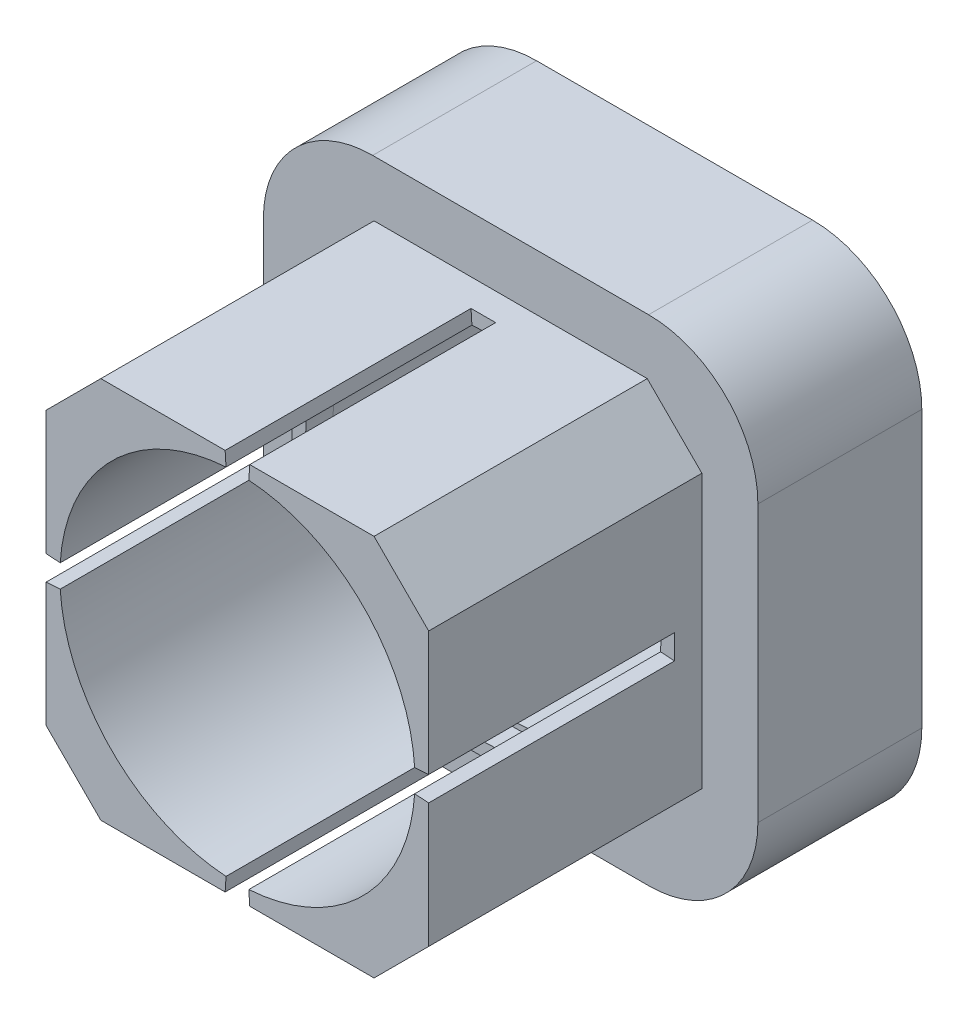
ISO-10303-21;
HEADER;
FILE_DESCRIPTION(('STEP AP214'),'2;1');
FILE_NAME('part.step','',(''),(''),'','','');
FILE_SCHEMA(('AUTOMOTIVE_DESIGN { 1 0 10303 214 1 1 1 1 }'));
ENDSEC;
DATA;
#1=APPLICATION_CONTEXT('core data for automotive mechanical design processes');
#2=APPLICATION_PROTOCOL_DEFINITION('international standard','automotive_design',2000,#1);
#3=PRODUCT_CONTEXT('',#1,'mechanical');
#4=PRODUCT('Part','Part','',(#3));
#5=PRODUCT_RELATED_PRODUCT_CATEGORY('part','',(#4));
#6=PRODUCT_DEFINITION_FORMATION('','',#4);
#7=PRODUCT_DEFINITION_CONTEXT('part definition',#1,'design');
#8=PRODUCT_DEFINITION('design','',#6,#7);
#9=PRODUCT_DEFINITION_SHAPE('','',#8);
#10=(LENGTH_UNIT() NAMED_UNIT(*) SI_UNIT(.MILLI.,.METRE.));
#11=(NAMED_UNIT(*) PLANE_ANGLE_UNIT() SI_UNIT($,.RADIAN.));
#12=(NAMED_UNIT(*) SI_UNIT($,.STERADIAN.) SOLID_ANGLE_UNIT());
#13=UNCERTAINTY_MEASURE_WITH_UNIT(LENGTH_MEASURE(1.E-05),#10,'distance_accuracy_value','');
#14=(GEOMETRIC_REPRESENTATION_CONTEXT(3) GLOBAL_UNCERTAINTY_ASSIGNED_CONTEXT((#13)) GLOBAL_UNIT_ASSIGNED_CONTEXT((#10,
#11,#12)) REPRESENTATION_CONTEXT('',''));
#15=CARTESIAN_POINT('',(0.,0.,0.));
#16=DIRECTION('',(0.,0.,1.));
#17=DIRECTION('',(1.,0.,0.));
#18=AXIS2_PLACEMENT_3D('',#15,#16,#17);
#19=CARTESIAN_POINT('',(0.,0.,16.));
#20=DIRECTION('',(0.,0.,1.));
#21=DIRECTION('',(1.,0.,0.));
#22=AXIS2_PLACEMENT_3D('',#19,#20,#21);
#23=PLANE('',#22);
#24=DIRECTION('',(-0.064153289317511,-0.997940056050334,0.));
#25=VECTOR('',#24,1.);
#26=CARTESIAN_POINT('',(-0.449999999999927,-7.,16.));
#27=LINE('',#26,#25);
#28=CARTESIAN_POINT('',(-0.416996380563821,-6.48661036432717,16.));
#29=VERTEX_POINT('',#28);
#30=CARTESIAN_POINT('',(-0.449999999999927,-7.,16.));
#31=VERTEX_POINT('',#30);
#32=EDGE_CURVE('E526',#29,#31,#27,.T.);
#33=ORIENTED_EDGE('',*,*,#32,.F.);
#34=CARTESIAN_POINT('',(0.,0.,16.));
#35=DIRECTION('',(0.,0.,1.));
#36=DIRECTION('',(1.,0.,0.));
#37=AXIS2_PLACEMENT_3D('',#34,#35,#36);
#38=CIRCLE('',#37,6.5);
#39=CARTESIAN_POINT('',(-6.48661036432717,-0.416996380563889,16.));
#40=VERTEX_POINT('',#39);
#41=EDGE_CURVE('E277',#40,#29,#38,.T.);
#42=ORIENTED_EDGE('',*,*,#41,.F.);
#43=DIRECTION('',(0.997940056050333,0.0641532893175214,0.));
#44=VECTOR('',#43,1.);
#45=CARTESIAN_POINT('',(0.,0.,16.));
#46=LINE('',#45,#44);
#47=CARTESIAN_POINT('',(-7.,-0.45,16.));
#48=VERTEX_POINT('',#47);
#49=EDGE_CURVE('E543',#48,#40,#46,.T.);
#50=ORIENTED_EDGE('',*,*,#49,.F.);
#51=DIRECTION('',(0.,-1.,0.));
#52=VECTOR('',#51,1.);
#53=CARTESIAN_POINT('',(-7.,-5.,16.));
#54=LINE('',#53,#52);
#55=CARTESIAN_POINT('',(-7.,-5.,16.));
#56=VERTEX_POINT('',#55);
#57=EDGE_CURVE('E311',#48,#56,#54,.T.);
#58=ORIENTED_EDGE('',*,*,#57,.T.);
#59=DIRECTION('',(0.707106781186548,-0.707106781186548,0.));
#60=VECTOR('',#59,1.);
#61=CARTESIAN_POINT('',(-7.,-5.,16.));
#62=LINE('',#61,#60);
#63=CARTESIAN_POINT('',(-5.,-7.,16.));
#64=VERTEX_POINT('',#63);
#65=EDGE_CURVE('E282',#56,#64,#62,.T.);
#66=ORIENTED_EDGE('',*,*,#65,.T.);
#67=DIRECTION('',(1.,0.,0.));
#68=VECTOR('',#67,1.);
#69=CARTESIAN_POINT('',(-5.,-7.,16.));
#70=LINE('',#69,#68);
#71=EDGE_CURVE('E288',#64,#31,#70,.T.);
#72=ORIENTED_EDGE('',*,*,#71,.T.);
#73=EDGE_LOOP('',(#33,#42,#50,#58,#66,#72));
#74=FACE_BOUND('',#73,.T.);
#75=ADVANCED_FACE('F41',(#74),#23,.T.);
#76=DIRECTION('',(-0.997940056050333,0.0641532893175214,0.));
#77=VECTOR('',#76,1.);
#78=CARTESIAN_POINT('',(-7.,0.45,16.));
#79=LINE('',#78,#77);
#80=CARTESIAN_POINT('',(-6.48661036432717,0.416996380563889,16.));
#81=VERTEX_POINT('',#80);
#82=CARTESIAN_POINT('',(-7.,0.45,16.));
#83=VERTEX_POINT('',#82);
#84=EDGE_CURVE('E536',#81,#83,#79,.T.);
#85=ORIENTED_EDGE('',*,*,#84,.F.);
#86=CARTESIAN_POINT('',(-0.416996380563912,6.48661036432717,16.));
#87=VERTEX_POINT('',#86);
#88=EDGE_CURVE('E636',#87,#81,#38,.T.);
#89=ORIENTED_EDGE('',*,*,#88,.F.);
#90=DIRECTION('',(0.0641532893175249,-0.997940056050333,0.));
#91=VECTOR('',#90,1.);
#92=CARTESIAN_POINT('',(0.,0.,16.));
#93=LINE('',#92,#91);
#94=CARTESIAN_POINT('',(-0.450000000000024,7.,16.));
#95=VERTEX_POINT('',#94);
#96=EDGE_CURVE('E565',#95,#87,#93,.T.);
#97=ORIENTED_EDGE('',*,*,#96,.F.);
#98=DIRECTION('',(-1.,0.,0.));
#99=VECTOR('',#98,1.);
#100=CARTESIAN_POINT('',(-4.99999999999999,7.,16.));
#101=LINE('',#100,#99);
#102=CARTESIAN_POINT('',(-4.99999999999999,7.,16.));
#103=VERTEX_POINT('',#102);
#104=EDGE_CURVE('E303',#95,#103,#101,.T.);
#105=ORIENTED_EDGE('',*,*,#104,.T.);
#106=DIRECTION('',(-0.70710678118655,-0.707106781186545,0.));
#107=VECTOR('',#106,1.);
#108=CARTESIAN_POINT('',(-4.99999999999999,7.,16.));
#109=LINE('',#108,#107);
#110=CARTESIAN_POINT('',(-7.,5.,16.));
#111=VERTEX_POINT('',#110);
#112=EDGE_CURVE('E308',#103,#111,#109,.T.);
#113=ORIENTED_EDGE('',*,*,#112,.T.);
#114=EDGE_CURVE('E312',#111,#83,#54,.T.);
#115=ORIENTED_EDGE('',*,*,#114,.T.);
#116=EDGE_LOOP('',(#85,#89,#97,#105,#113,#115));
#117=FACE_BOUND('',#116,.T.);
#118=ADVANCED_FACE('F674',(#117),#23,.T.);
#119=DIRECTION('',(0.0641532893175179,0.997940056050334,0.));
#120=VECTOR('',#119,1.);
#121=CARTESIAN_POINT('',(0.449999999999976,7.,16.));
#122=LINE('',#121,#120);
#123=CARTESIAN_POINT('',(0.416996380563867,6.48661036432717,16.));
#124=VERTEX_POINT('',#123);
#125=CARTESIAN_POINT('',(0.449999999999976,7.,16.));
#126=VERTEX_POINT('',#125);
#127=EDGE_CURVE('E557',#124,#126,#122,.T.);
#128=ORIENTED_EDGE('',*,*,#127,.F.);
#129=CARTESIAN_POINT('',(6.48661036432717,0.416996380563889,16.));
#130=VERTEX_POINT('',#129);
#131=EDGE_CURVE('E279',#130,#124,#38,.T.);
#132=ORIENTED_EDGE('',*,*,#131,.F.);
#133=DIRECTION('',(-0.997940056050333,-0.0641532893175214,0.));
#134=VECTOR('',#133,1.);
#135=CARTESIAN_POINT('',(0.,0.,16.));
#136=LINE('',#135,#134);
#137=CARTESIAN_POINT('',(7.,0.45,16.));
#138=VERTEX_POINT('',#137);
#139=EDGE_CURVE('E587',#138,#130,#136,.T.);
#140=ORIENTED_EDGE('',*,*,#139,.F.);
#141=DIRECTION('',(0.,1.,0.));
#142=VECTOR('',#141,1.);
#143=CARTESIAN_POINT('',(7.,-4.99999999999999,16.));
#144=LINE('',#143,#142);
#145=CARTESIAN_POINT('',(7.,5.,16.));
#146=VERTEX_POINT('',#145);
#147=EDGE_CURVE('E295',#138,#146,#144,.T.);
#148=ORIENTED_EDGE('',*,*,#147,.T.);
#149=DIRECTION('',(-0.707106781186547,0.707106781186548,0.));
#150=VECTOR('',#149,1.);
#151=CARTESIAN_POINT('',(5.,7.,16.));
#152=LINE('',#151,#150);
#153=CARTESIAN_POINT('',(5.,7.,16.));
#154=VERTEX_POINT('',#153);
#155=EDGE_CURVE('E300',#146,#154,#152,.T.);
#156=ORIENTED_EDGE('',*,*,#155,.T.);
#157=EDGE_CURVE('E304',#154,#126,#101,.T.);
#158=ORIENTED_EDGE('',*,*,#157,.T.);
#159=EDGE_LOOP('',(#128,#132,#140,#148,#156,#158));
#160=FACE_BOUND('',#159,.T.);
#161=ADVANCED_FACE('F628',(#160),#23,.T.);
#162=CARTESIAN_POINT('',(5.05,5.05,6.));
#163=DIRECTION('',(0.,0.,-1.));
#164=DIRECTION('',(-1.,0.,0.));
#165=AXIS2_PLACEMENT_3D('',#162,#163,#164);
#166=CYLINDRICAL_SURFACE('',#165,4.00000000000001);
#167=CARTESIAN_POINT('',(5.05,5.05,0.));
#168=DIRECTION('',(0.,0.,1.));
#169=DIRECTION('',(-1.,0.,0.));
#170=AXIS2_PLACEMENT_3D('',#167,#168,#169);
#171=CIRCLE('',#170,4.00000000000001);
#172=CARTESIAN_POINT('',(9.05,5.05,0.));
#173=VERTEX_POINT('',#172);
#174=CARTESIAN_POINT('',(5.05,9.05,0.));
#175=VERTEX_POINT('',#174);
#176=EDGE_CURVE('E379',#173,#175,#171,.T.);
#177=ORIENTED_EDGE('',*,*,#176,.T.);
#178=DIRECTION('',(0.,0.,-1.));
#179=VECTOR('',#178,1.);
#180=CARTESIAN_POINT('',(5.05,9.05,6.));
#181=LINE('',#180,#179);
#182=CARTESIAN_POINT('',(5.05,9.05,6.));
#183=VERTEX_POINT('',#182);
#184=EDGE_CURVE('E457',#183,#175,#181,.T.);
#185=ORIENTED_EDGE('',*,*,#184,.F.);
#186=CARTESIAN_POINT('',(5.05,5.05,6.));
#187=DIRECTION('',(0.,0.,1.));
#188=DIRECTION('',(-1.,0.,0.));
#189=AXIS2_PLACEMENT_3D('',#186,#187,#188);
#190=CIRCLE('',#189,4.00000000000001);
#191=CARTESIAN_POINT('',(9.05,5.05,6.));
#192=VERTEX_POINT('',#191);
#193=EDGE_CURVE('E380',#192,#183,#190,.T.);
#194=ORIENTED_EDGE('',*,*,#193,.F.);
#195=DIRECTION('',(0.,0.,-1.));
#196=VECTOR('',#195,1.);
#197=CARTESIAN_POINT('',(9.05,5.05,6.));
#198=LINE('',#197,#196);
#199=EDGE_CURVE('E406',#192,#173,#198,.T.);
#200=ORIENTED_EDGE('',*,*,#199,.T.);
#201=EDGE_LOOP('',(#177,#185,#194,#200));
#202=FACE_BOUND('',#201,.T.);
#203=ADVANCED_FACE('F43',(#202),#166,.T.);
#204=CARTESIAN_POINT('',(-5.05,9.05,6.));
#205=DIRECTION('',(0.,-1.,0.));
#206=DIRECTION('',(0.,0.,-1.));
#207=AXIS2_PLACEMENT_3D('',#204,#205,#206);
#208=PLANE('',#207);
#209=DIRECTION('',(-1.,0.,0.));
#210=VECTOR('',#209,1.);
#211=CARTESIAN_POINT('',(-5.05,9.05,0.));
#212=LINE('',#211,#210);
#213=CARTESIAN_POINT('',(-5.05,9.05,0.));
#214=VERTEX_POINT('',#213);
#215=EDGE_CURVE('E410',#175,#214,#212,.T.);
#216=ORIENTED_EDGE('',*,*,#215,.T.);
#217=DIRECTION('',(0.,0.,-1.));
#218=VECTOR('',#217,1.);
#219=CARTESIAN_POINT('',(-5.05,9.05,6.));
#220=LINE('',#219,#218);
#221=CARTESIAN_POINT('',(-5.05,9.05,6.));
#222=VERTEX_POINT('',#221);
#223=EDGE_CURVE('E453',#222,#214,#220,.T.);
#224=ORIENTED_EDGE('',*,*,#223,.F.);
#225=DIRECTION('',(-1.,0.,0.));
#226=VECTOR('',#225,1.);
#227=CARTESIAN_POINT('',(-5.05,9.05,6.));
#228=LINE('',#227,#226);
#229=EDGE_CURVE('E384',#183,#222,#228,.T.);
#230=ORIENTED_EDGE('',*,*,#229,.F.);
#231=ORIENTED_EDGE('',*,*,#184,.T.);
#232=EDGE_LOOP('',(#216,#224,#230,#231));
#233=FACE_BOUND('',#232,.T.);
#234=ADVANCED_FACE('F720',(#233),#208,.F.);
#235=CARTESIAN_POINT('',(-5.04999999999999,5.04999999999999,6.));
#236=DIRECTION('',(0.,0.,-1.));
#237=DIRECTION('',(-1.,0.,0.));
#238=AXIS2_PLACEMENT_3D('',#235,#236,#237);
#239=CYLINDRICAL_SURFACE('',#238,4.00000000000002);
#240=CARTESIAN_POINT('',(-5.04999999999999,5.04999999999999,0.));
#241=DIRECTION('',(0.,0.,1.));
#242=DIRECTION('',(-1.,0.,0.));
#243=AXIS2_PLACEMENT_3D('',#240,#241,#242);
#244=CIRCLE('',#243,4.00000000000002);
#245=CARTESIAN_POINT('',(-9.05,5.05,0.));
#246=VERTEX_POINT('',#245);
#247=EDGE_CURVE('E413',#214,#246,#244,.T.);
#248=ORIENTED_EDGE('',*,*,#247,.T.);
#249=DIRECTION('',(0.,0.,-1.));
#250=VECTOR('',#249,1.);
#251=CARTESIAN_POINT('',(-9.05,5.05,6.));
#252=LINE('',#251,#250);
#253=CARTESIAN_POINT('',(-9.05,5.05,6.));
#254=VERTEX_POINT('',#253);
#255=EDGE_CURVE('E449',#254,#246,#252,.T.);
#256=ORIENTED_EDGE('',*,*,#255,.F.);
#257=CARTESIAN_POINT('',(-5.04999999999999,5.04999999999999,6.));
#258=DIRECTION('',(0.,0.,1.));
#259=DIRECTION('',(-1.,0.,0.));
#260=AXIS2_PLACEMENT_3D('',#257,#258,#259);
#261=CIRCLE('',#260,4.00000000000002);
#262=EDGE_CURVE('E388',#222,#254,#261,.T.);
#263=ORIENTED_EDGE('',*,*,#262,.F.);
#264=ORIENTED_EDGE('',*,*,#223,.T.);
#265=EDGE_LOOP('',(#248,#256,#263,#264));
#266=FACE_BOUND('',#265,.T.);
#267=ADVANCED_FACE('F725',(#266),#239,.T.);
#268=CARTESIAN_POINT('',(-9.05,-5.05,6.));
#269=DIRECTION('',(1.,0.,0.));
#270=DIRECTION('',(0.,0.,-1.));
#271=AXIS2_PLACEMENT_3D('',#268,#269,#270);
#272=PLANE('',#271);
#273=DIRECTION('',(0.,-1.,0.));
#274=VECTOR('',#273,1.);
#275=CARTESIAN_POINT('',(-9.05,-5.05,0.));
#276=LINE('',#275,#274);
#277=CARTESIAN_POINT('',(-9.05,-5.05,0.));
#278=VERTEX_POINT('',#277);
#279=EDGE_CURVE('E416',#246,#278,#276,.T.);
#280=ORIENTED_EDGE('',*,*,#279,.T.);
#281=DIRECTION('',(0.,0.,-1.));
#282=VECTOR('',#281,1.);
#283=CARTESIAN_POINT('',(-9.05,-5.05,6.));
#284=LINE('',#283,#282);
#285=CARTESIAN_POINT('',(-9.05,-5.05,6.));
#286=VERTEX_POINT('',#285);
#287=EDGE_CURVE('E445',#286,#278,#284,.T.);
#288=ORIENTED_EDGE('',*,*,#287,.F.);
#289=DIRECTION('',(0.,-1.,0.));
#290=VECTOR('',#289,1.);
#291=CARTESIAN_POINT('',(-9.05,-5.05,6.));
#292=LINE('',#291,#290);
#293=EDGE_CURVE('E391',#254,#286,#292,.T.);
#294=ORIENTED_EDGE('',*,*,#293,.F.);
#295=ORIENTED_EDGE('',*,*,#255,.T.);
#296=EDGE_LOOP('',(#280,#288,#294,#295));
#297=FACE_BOUND('',#296,.T.);
#298=ADVANCED_FACE('F759',(#297),#272,.F.);
#299=CARTESIAN_POINT('',(-5.04999999999999,-5.04999999999999,6.));
#300=DIRECTION('',(0.,0.,-1.));
#301=DIRECTION('',(-1.,0.,0.));
#302=AXIS2_PLACEMENT_3D('',#299,#300,#301);
#303=CYLINDRICAL_SURFACE('',#302,4.00000000000001);
#304=CARTESIAN_POINT('',(-5.04999999999999,-5.04999999999999,0.));
#305=DIRECTION('',(0.,0.,1.));
#306=DIRECTION('',(-1.,0.,0.));
#307=AXIS2_PLACEMENT_3D('',#304,#305,#306);
#308=CIRCLE('',#307,4.00000000000001);
#309=CARTESIAN_POINT('',(-5.05,-9.05,0.));
#310=VERTEX_POINT('',#309);
#311=EDGE_CURVE('E419',#278,#310,#308,.T.);
#312=ORIENTED_EDGE('',*,*,#311,.T.);
#313=DIRECTION('',(0.,0.,-1.));
#314=VECTOR('',#313,1.);
#315=CARTESIAN_POINT('',(-5.05,-9.05,6.));
#316=LINE('',#315,#314);
#317=CARTESIAN_POINT('',(-5.05,-9.05,6.));
#318=VERTEX_POINT('',#317);
#319=EDGE_CURVE('E441',#318,#310,#316,.T.);
#320=ORIENTED_EDGE('',*,*,#319,.F.);
#321=CARTESIAN_POINT('',(-5.04999999999999,-5.04999999999999,6.));
#322=DIRECTION('',(0.,0.,1.));
#323=DIRECTION('',(-1.,0.,0.));
#324=AXIS2_PLACEMENT_3D('',#321,#322,#323);
#325=CIRCLE('',#324,4.00000000000001);
#326=EDGE_CURVE('E394',#286,#318,#325,.T.);
#327=ORIENTED_EDGE('',*,*,#326,.F.);
#328=ORIENTED_EDGE('',*,*,#287,.T.);
#329=EDGE_LOOP('',(#312,#320,#327,#328));
#330=FACE_BOUND('',#329,.T.);
#331=ADVANCED_FACE('F755',(#330),#303,.T.);
#332=CARTESIAN_POINT('',(-5.05,-9.05,6.));
#333=DIRECTION('',(0.,1.,0.));
#334=DIRECTION('',(0.,0.,1.));
#335=AXIS2_PLACEMENT_3D('',#332,#333,#334);
#336=PLANE('',#335);
#337=DIRECTION('',(1.,0.,0.));
#338=VECTOR('',#337,1.);
#339=CARTESIAN_POINT('',(-5.05,-9.05,0.));
#340=LINE('',#339,#338);
#341=CARTESIAN_POINT('',(5.05,-9.05,0.));
#342=VERTEX_POINT('',#341);
#343=EDGE_CURVE('E422',#310,#342,#340,.T.);
#344=ORIENTED_EDGE('',*,*,#343,.T.);
#345=DIRECTION('',(0.,0.,-1.));
#346=VECTOR('',#345,1.);
#347=CARTESIAN_POINT('',(5.05,-9.05,6.));
#348=LINE('',#347,#346);
#349=CARTESIAN_POINT('',(5.05,-9.05,6.));
#350=VERTEX_POINT('',#349);
#351=EDGE_CURVE('E437',#350,#342,#348,.T.);
#352=ORIENTED_EDGE('',*,*,#351,.F.);
#353=DIRECTION('',(1.,0.,0.));
#354=VECTOR('',#353,1.);
#355=CARTESIAN_POINT('',(-5.05,-9.05,6.));
#356=LINE('',#355,#354);
#357=EDGE_CURVE('E397',#318,#350,#356,.T.);
#358=ORIENTED_EDGE('',*,*,#357,.F.);
#359=ORIENTED_EDGE('',*,*,#319,.T.);
#360=EDGE_LOOP('',(#344,#352,#358,#359));
#361=FACE_BOUND('',#360,.T.);
#362=ADVANCED_FACE('F750',(#361),#336,.F.);
#363=CARTESIAN_POINT('',(5.04999999999999,-5.04999999999999,6.));
#364=DIRECTION('',(0.,0.,-1.));
#365=DIRECTION('',(-1.,0.,0.));
#366=AXIS2_PLACEMENT_3D('',#363,#364,#365);
#367=CYLINDRICAL_SURFACE('',#366,4.00000000000001);
#368=CARTESIAN_POINT('',(5.04999999999999,-5.04999999999999,0.));
#369=DIRECTION('',(0.,0.,1.));
#370=DIRECTION('',(-1.,0.,0.));
#371=AXIS2_PLACEMENT_3D('',#368,#369,#370);
#372=CIRCLE('',#371,4.00000000000001);
#373=CARTESIAN_POINT('',(9.05,-5.05,0.));
#374=VERTEX_POINT('',#373);
#375=EDGE_CURVE('E425',#342,#374,#372,.T.);
#376=ORIENTED_EDGE('',*,*,#375,.T.);
#377=DIRECTION('',(0.,0.,-1.));
#378=VECTOR('',#377,1.);
#379=CARTESIAN_POINT('',(9.05,-5.05,6.));
#380=LINE('',#379,#378);
#381=CARTESIAN_POINT('',(9.05,-5.05,6.));
#382=VERTEX_POINT('',#381);
#383=EDGE_CURVE('E433',#382,#374,#380,.T.);
#384=ORIENTED_EDGE('',*,*,#383,.F.);
#385=CARTESIAN_POINT('',(5.04999999999999,-5.04999999999999,6.));
#386=DIRECTION('',(0.,0.,1.));
#387=DIRECTION('',(-1.,0.,0.));
#388=AXIS2_PLACEMENT_3D('',#385,#386,#387);
#389=CIRCLE('',#388,4.00000000000001);
#390=EDGE_CURVE('E400',#350,#382,#389,.T.);
#391=ORIENTED_EDGE('',*,*,#390,.F.);
#392=ORIENTED_EDGE('',*,*,#351,.T.);
#393=EDGE_LOOP('',(#376,#384,#391,#392));
#394=FACE_BOUND('',#393,.T.);
#395=ADVANCED_FACE('F745',(#394),#367,.T.);
#396=CARTESIAN_POINT('',(9.05,-5.05,6.));
#397=DIRECTION('',(-1.,0.,0.));
#398=DIRECTION('',(0.,0.,1.));
#399=AXIS2_PLACEMENT_3D('',#396,#397,#398);
#400=PLANE('',#399);
#401=DIRECTION('',(0.,1.,0.));
#402=VECTOR('',#401,1.);
#403=CARTESIAN_POINT('',(9.05,-5.05,0.));
#404=LINE('',#403,#402);
#405=EDGE_CURVE('E385',#374,#173,#404,.T.);
#406=ORIENTED_EDGE('',*,*,#405,.T.);
#407=ORIENTED_EDGE('',*,*,#199,.F.);
#408=DIRECTION('',(0.,1.,0.));
#409=VECTOR('',#408,1.);
#410=CARTESIAN_POINT('',(9.05,-5.05,6.));
#411=LINE('',#410,#409);
#412=EDGE_CURVE('E403',#382,#192,#411,.T.);
#413=ORIENTED_EDGE('',*,*,#412,.F.);
#414=ORIENTED_EDGE('',*,*,#383,.T.);
#415=EDGE_LOOP('',(#406,#407,#413,#414));
#416=FACE_BOUND('',#415,.T.);
#417=ADVANCED_FACE('F743',(#416),#400,.F.);
#418=CARTESIAN_POINT('',(5.05,5.05,6.));
#419=DIRECTION('',(0.,0.,-1.));
#420=DIRECTION('',(-1.,0.,0.));
#421=AXIS2_PLACEMENT_3D('',#418,#419,#420);
#422=PLANE('',#421);
#423=DIRECTION('',(0.707106781186548,-0.707106781186548,0.));
#424=VECTOR('',#423,1.);
#425=CARTESIAN_POINT('',(-7.,-5.,6.));
#426=LINE('',#425,#424);
#427=CARTESIAN_POINT('',(-7.,-5.,6.));
#428=VERTEX_POINT('',#427);
#429=CARTESIAN_POINT('',(-5.,-7.,6.));
#430=VERTEX_POINT('',#429);
#431=EDGE_CURVE('E317',#428,#430,#426,.T.);
#432=ORIENTED_EDGE('',*,*,#431,.F.);
#433=DIRECTION('',(0.,-1.,0.));
#434=VECTOR('',#433,1.);
#435=CARTESIAN_POINT('',(-7.,-5.,6.));
#436=LINE('',#435,#434);
#437=CARTESIAN_POINT('',(-7.,5.,6.));
#438=VERTEX_POINT('',#437);
#439=EDGE_CURVE('E287',#438,#428,#436,.T.);
#440=ORIENTED_EDGE('',*,*,#439,.F.);
#441=DIRECTION('',(-0.70710678118655,-0.707106781186545,0.));
#442=VECTOR('',#441,1.);
#443=CARTESIAN_POINT('',(-4.99999999999999,7.,6.));
#444=LINE('',#443,#442);
#445=CARTESIAN_POINT('',(-4.99999999999999,7.,6.));
#446=VERTEX_POINT('',#445);
#447=EDGE_CURVE('E341',#446,#438,#444,.T.);
#448=ORIENTED_EDGE('',*,*,#447,.F.);
#449=DIRECTION('',(-1.,0.,0.));
#450=VECTOR('',#449,1.);
#451=CARTESIAN_POINT('',(-4.99999999999999,7.,6.));
#452=LINE('',#451,#450);
#453=CARTESIAN_POINT('',(5.,7.,6.));
#454=VERTEX_POINT('',#453);
#455=EDGE_CURVE('E337',#454,#446,#452,.T.);
#456=ORIENTED_EDGE('',*,*,#455,.F.);
#457=DIRECTION('',(-0.707106781186547,0.707106781186548,0.));
#458=VECTOR('',#457,1.);
#459=CARTESIAN_POINT('',(5.,7.,6.));
#460=LINE('',#459,#458);
#461=CARTESIAN_POINT('',(7.,5.,6.));
#462=VERTEX_POINT('',#461);
#463=EDGE_CURVE('E333',#462,#454,#460,.T.);
#464=ORIENTED_EDGE('',*,*,#463,.F.);
#465=DIRECTION('',(0.,1.,0.));
#466=VECTOR('',#465,1.);
#467=CARTESIAN_POINT('',(7.,-4.99999999999999,6.));
#468=LINE('',#467,#466);
#469=CARTESIAN_POINT('',(7.,-4.99999999999999,6.));
#470=VERTEX_POINT('',#469);
#471=EDGE_CURVE('E329',#470,#462,#468,.T.);
#472=ORIENTED_EDGE('',*,*,#471,.F.);
#473=DIRECTION('',(0.707106781186549,0.707106781186546,0.));
#474=VECTOR('',#473,1.);
#475=CARTESIAN_POINT('',(4.99999999999999,-7.,6.));
#476=LINE('',#475,#474);
#477=CARTESIAN_POINT('',(4.99999999999999,-7.,6.));
#478=VERTEX_POINT('',#477);
#479=EDGE_CURVE('E325',#478,#470,#476,.T.);
#480=ORIENTED_EDGE('',*,*,#479,.F.);
#481=DIRECTION('',(1.,0.,0.));
#482=VECTOR('',#481,1.);
#483=CARTESIAN_POINT('',(-5.,-7.,6.));
#484=LINE('',#483,#482);
#485=EDGE_CURVE('E321',#430,#478,#484,.T.);
#486=ORIENTED_EDGE('',*,*,#485,.F.);
#487=EDGE_LOOP('',(#432,#440,#448,#456,#464,#472,#480,#486));
#488=FACE_BOUND('',#487,.T.);
#489=ORIENTED_EDGE('',*,*,#193,.T.);
#490=ORIENTED_EDGE('',*,*,#229,.T.);
#491=ORIENTED_EDGE('',*,*,#262,.T.);
#492=ORIENTED_EDGE('',*,*,#293,.T.);
#493=ORIENTED_EDGE('',*,*,#326,.T.);
#494=ORIENTED_EDGE('',*,*,#357,.T.);
#495=ORIENTED_EDGE('',*,*,#390,.T.);
#496=ORIENTED_EDGE('',*,*,#412,.T.);
#497=EDGE_LOOP('',(#489,#490,#491,#492,#493,#494,#495,#496));
#498=FACE_BOUND('',#497,.T.);
#499=ADVANCED_FACE('F713',(#488,#498),#422,.F.);
#500=CARTESIAN_POINT('',(5.05,5.05,0.));
#501=DIRECTION('',(0.,0.,-1.));
#502=DIRECTION('',(-1.,0.,0.));
#503=AXIS2_PLACEMENT_3D('',#500,#501,#502);
#504=PLANE('',#503);
#505=CARTESIAN_POINT('',(0.,0.19248885157555,0.));
#506=DIRECTION('',(0.,0.,-1.));
#507=DIRECTION('',(-1.,0.,0.));
#508=AXIS2_PLACEMENT_3D('',#505,#506,#507);
#509=CIRCLE('',#508,6.5);
#510=CARTESIAN_POINT('',(-6.5,0.19248885157555,0.));
#511=VERTEX_POINT('',#510);
#512=EDGE_CURVE('E45',#511,#511,#509,.T.);
#513=ORIENTED_EDGE('',*,*,#512,.F.);
#514=EDGE_LOOP('',(#513));
#515=FACE_BOUND('',#514,.T.);
#516=ORIENTED_EDGE('',*,*,#176,.F.);
#517=ORIENTED_EDGE('',*,*,#405,.F.);
#518=ORIENTED_EDGE('',*,*,#375,.F.);
#519=ORIENTED_EDGE('',*,*,#343,.F.);
#520=ORIENTED_EDGE('',*,*,#311,.F.);
#521=ORIENTED_EDGE('',*,*,#279,.F.);
#522=ORIENTED_EDGE('',*,*,#247,.F.);
#523=ORIENTED_EDGE('',*,*,#215,.F.);
#524=EDGE_LOOP('',(#516,#517,#518,#519,#520,#521,#522,#523));
#525=FACE_BOUND('',#524,.T.);
#526=ADVANCED_FACE('F706',(#515,#525),#504,.T.);
#527=DIRECTION('',(-0.0641532893175319,0.997940056050333,0.));
#528=VECTOR('',#527,1.);
#529=CARTESIAN_POINT('',(0.,0.,16.));
#530=LINE('',#529,#528);
#531=CARTESIAN_POINT('',(0.450000000000073,-6.99999999999999,16.));
#532=VERTEX_POINT('',#531);
#533=CARTESIAN_POINT('',(0.416996380563957,-6.48661036432716,16.));
#534=VERTEX_POINT('',#533);
#535=EDGE_CURVE('E505',#532,#534,#530,.T.);
#536=ORIENTED_EDGE('',*,*,#535,.F.);
#537=CARTESIAN_POINT('',(4.99999999999999,-7.,16.));
#538=VERTEX_POINT('',#537);
#539=EDGE_CURVE('E286',#532,#538,#70,.T.);
#540=ORIENTED_EDGE('',*,*,#539,.T.);
#541=DIRECTION('',(0.707106781186549,0.707106781186546,0.));
#542=VECTOR('',#541,1.);
#543=CARTESIAN_POINT('',(4.99999999999999,-7.,16.));
#544=LINE('',#543,#542);
#545=CARTESIAN_POINT('',(7.,-4.99999999999999,16.));
#546=VERTEX_POINT('',#545);
#547=EDGE_CURVE('E292',#538,#546,#544,.T.);
#548=ORIENTED_EDGE('',*,*,#547,.T.);
#549=CARTESIAN_POINT('',(7.,-0.45,16.));
#550=VERTEX_POINT('',#549);
#551=EDGE_CURVE('E296',#546,#550,#144,.T.);
#552=ORIENTED_EDGE('',*,*,#551,.T.);
#553=DIRECTION('',(0.997940056050333,-0.0641532893175214,0.));
#554=VECTOR('',#553,1.);
#555=CARTESIAN_POINT('',(7.,-0.45,16.));
#556=LINE('',#555,#554);
#557=CARTESIAN_POINT('',(6.48661036432717,-0.416996380563889,16.));
#558=VERTEX_POINT('',#557);
#559=EDGE_CURVE('E579',#558,#550,#556,.T.);
#560=ORIENTED_EDGE('',*,*,#559,.F.);
#561=EDGE_CURVE('E275',#534,#558,#38,.T.);
#562=ORIENTED_EDGE('',*,*,#561,.F.);
#563=EDGE_LOOP('',(#536,#540,#548,#552,#560,#562));
#564=FACE_BOUND('',#563,.T.);
#565=ADVANCED_FACE('F611',(#564),#23,.T.);
#566=CARTESIAN_POINT('',(-7.,-5.,16.));
#567=DIRECTION('',(0.707106781186548,0.707106781186548,0.));
#568=DIRECTION('',(-0.707106781186548,0.707106781186548,0.));
#569=AXIS2_PLACEMENT_3D('',#566,#567,#568);
#570=PLANE('',#569);
#571=ORIENTED_EDGE('',*,*,#431,.T.);
#572=DIRECTION('',(0.,0.,-1.));
#573=VECTOR('',#572,1.);
#574=CARTESIAN_POINT('',(-5.,-7.,16.));
#575=LINE('',#574,#573);
#576=EDGE_CURVE('E375',#64,#430,#575,.T.);
#577=ORIENTED_EDGE('',*,*,#576,.F.);
#578=ORIENTED_EDGE('',*,*,#65,.F.);
#579=DIRECTION('',(0.,0.,-1.));
#580=VECTOR('',#579,1.);
#581=CARTESIAN_POINT('',(-7.,-5.,16.));
#582=LINE('',#581,#580);
#583=EDGE_CURVE('E316',#56,#428,#582,.T.);
#584=ORIENTED_EDGE('',*,*,#583,.T.);
#585=EDGE_LOOP('',(#571,#577,#578,#584));
#586=FACE_BOUND('',#585,.T.);
#587=ADVANCED_FACE('F705',(#586),#570,.F.);
#588=CARTESIAN_POINT('',(-5.,-7.,16.));
#589=DIRECTION('',(0.,1.,0.));
#590=DIRECTION('',(-1.,0.,0.));
#591=AXIS2_PLACEMENT_3D('',#588,#589,#590);
#592=PLANE('',#591);
#593=DIRECTION('',(1.,0.,0.));
#594=VECTOR('',#593,1.);
#595=CARTESIAN_POINT('',(0.450000000000073,-6.99999999999999,7.));
#596=LINE('',#595,#594);
#597=CARTESIAN_POINT('',(-0.449999999999927,-7.,7.));
#598=VERTEX_POINT('',#597);
#599=CARTESIAN_POINT('',(0.450000000000073,-6.99999999999999,7.));
#600=VERTEX_POINT('',#599);
#601=EDGE_CURVE('E521',#598,#600,#596,.T.);
#602=ORIENTED_EDGE('',*,*,#601,.F.);
#603=DIRECTION('',(0.,0.,1.));
#604=VECTOR('',#603,1.);
#605=CARTESIAN_POINT('',(-0.449999999999927,-7.,7.));
#606=LINE('',#605,#604);
#607=EDGE_CURVE('E518',#598,#31,#606,.T.);
#608=ORIENTED_EDGE('',*,*,#607,.T.);
#609=ORIENTED_EDGE('',*,*,#71,.F.);
#610=ORIENTED_EDGE('',*,*,#576,.T.);
#611=ORIENTED_EDGE('',*,*,#485,.T.);
#612=DIRECTION('',(0.,0.,-1.));
#613=VECTOR('',#612,1.);
#614=CARTESIAN_POINT('',(4.99999999999999,-7.,16.));
#615=LINE('',#614,#613);
#616=EDGE_CURVE('E371',#538,#478,#615,.T.);
#617=ORIENTED_EDGE('',*,*,#616,.F.);
#618=ORIENTED_EDGE('',*,*,#539,.F.);
#619=DIRECTION('',(0.,0.,1.));
#620=VECTOR('',#619,1.);
#621=CARTESIAN_POINT('',(0.450000000000073,-6.99999999999999,7.));
#622=LINE('',#621,#620);
#623=EDGE_CURVE('E533',#600,#532,#622,.T.);
#624=ORIENTED_EDGE('',*,*,#623,.F.);
#625=EDGE_LOOP('',(#602,#608,#609,#610,#611,#617,#618,#624));
#626=FACE_BOUND('',#625,.T.);
#627=ADVANCED_FACE('F645',(#626),#592,.F.);
#628=CARTESIAN_POINT('',(4.99999999999999,-7.,16.));
#629=DIRECTION('',(-0.707106781186546,0.707106781186549,0.));
#630=DIRECTION('',(-0.707106781186549,-0.707106781186546,0.));
#631=AXIS2_PLACEMENT_3D('',#628,#629,#630);
#632=PLANE('',#631);
#633=ORIENTED_EDGE('',*,*,#479,.T.);
#634=DIRECTION('',(0.,0.,-1.));
#635=VECTOR('',#634,1.);
#636=CARTESIAN_POINT('',(7.,-4.99999999999999,16.));
#637=LINE('',#636,#635);
#638=EDGE_CURVE('E367',#546,#470,#637,.T.);
#639=ORIENTED_EDGE('',*,*,#638,.F.);
#640=ORIENTED_EDGE('',*,*,#547,.F.);
#641=ORIENTED_EDGE('',*,*,#616,.T.);
#642=EDGE_LOOP('',(#633,#639,#640,#641));
#643=FACE_BOUND('',#642,.T.);
#644=ADVANCED_FACE('F617',(#643),#632,.F.);
#645=CARTESIAN_POINT('',(7.,-4.99999999999999,16.));
#646=DIRECTION('',(-1.,0.,0.));
#647=DIRECTION('',(0.,0.,1.));
#648=AXIS2_PLACEMENT_3D('',#645,#646,#647);
#649=PLANE('',#648);
#650=DIRECTION('',(0.,1.,0.));
#651=VECTOR('',#650,1.);
#652=CARTESIAN_POINT('',(7.,0.45,7.));
#653=LINE('',#652,#651);
#654=CARTESIAN_POINT('',(7.,-0.45,7.));
#655=VERTEX_POINT('',#654);
#656=CARTESIAN_POINT('',(7.,0.45,7.));
#657=VERTEX_POINT('',#656);
#658=EDGE_CURVE('E586',#655,#657,#653,.T.);
#659=ORIENTED_EDGE('',*,*,#658,.F.);
#660=DIRECTION('',(0.,0.,1.));
#661=VECTOR('',#660,1.);
#662=CARTESIAN_POINT('',(7.,-0.45,7.));
#663=LINE('',#662,#661);
#664=EDGE_CURVE('E593',#655,#550,#663,.T.);
#665=ORIENTED_EDGE('',*,*,#664,.T.);
#666=ORIENTED_EDGE('',*,*,#551,.F.);
#667=ORIENTED_EDGE('',*,*,#638,.T.);
#668=ORIENTED_EDGE('',*,*,#471,.T.);
#669=DIRECTION('',(0.,0.,-1.));
#670=VECTOR('',#669,1.);
#671=CARTESIAN_POINT('',(7.,5.,16.));
#672=LINE('',#671,#670);
#673=EDGE_CURVE('E363',#146,#462,#672,.T.);
#674=ORIENTED_EDGE('',*,*,#673,.F.);
#675=ORIENTED_EDGE('',*,*,#147,.F.);
#676=DIRECTION('',(0.,0.,1.));
#677=VECTOR('',#676,1.);
#678=CARTESIAN_POINT('',(7.,0.45,7.));
#679=LINE('',#678,#677);
#680=EDGE_CURVE('E271',#657,#138,#679,.T.);
#681=ORIENTED_EDGE('',*,*,#680,.F.);
#682=EDGE_LOOP('',(#659,#665,#666,#667,#668,#674,#675,#681));
#683=FACE_BOUND('',#682,.T.);
#684=ADVANCED_FACE('F605',(#683),#649,.F.);
#685=CARTESIAN_POINT('',(5.,7.,16.));
#686=DIRECTION('',(-0.707106781186548,-0.707106781186547,0.));
#687=DIRECTION('',(0.707106781186547,-0.707106781186548,0.));
#688=AXIS2_PLACEMENT_3D('',#685,#686,#687);
#689=PLANE('',#688);
#690=ORIENTED_EDGE('',*,*,#463,.T.);
#691=DIRECTION('',(0.,0.,-1.));
#692=VECTOR('',#691,1.);
#693=CARTESIAN_POINT('',(5.,7.,16.));
#694=LINE('',#693,#692);
#695=EDGE_CURVE('E359',#154,#454,#694,.T.);
#696=ORIENTED_EDGE('',*,*,#695,.F.);
#697=ORIENTED_EDGE('',*,*,#155,.F.);
#698=ORIENTED_EDGE('',*,*,#673,.T.);
#699=EDGE_LOOP('',(#690,#696,#697,#698));
#700=FACE_BOUND('',#699,.T.);
#701=ADVANCED_FACE('F623',(#700),#689,.F.);
#702=CARTESIAN_POINT('',(-4.99999999999999,7.,16.));
#703=DIRECTION('',(0.,-1.,0.));
#704=DIRECTION('',(1.,0.,0.));
#705=AXIS2_PLACEMENT_3D('',#702,#703,#704);
#706=PLANE('',#705);
#707=DIRECTION('',(-1.,0.,0.));
#708=VECTOR('',#707,1.);
#709=CARTESIAN_POINT('',(-0.450000000000024,7.,7.));
#710=LINE('',#709,#708);
#711=CARTESIAN_POINT('',(0.449999999999976,7.,7.));
#712=VERTEX_POINT('',#711);
#713=CARTESIAN_POINT('',(-0.450000000000024,7.,7.));
#714=VERTEX_POINT('',#713);
#715=EDGE_CURVE('E564',#712,#714,#710,.T.);
#716=ORIENTED_EDGE('',*,*,#715,.F.);
#717=DIRECTION('',(0.,0.,1.));
#718=VECTOR('',#717,1.);
#719=CARTESIAN_POINT('',(0.449999999999976,7.,7.));
#720=LINE('',#719,#718);
#721=EDGE_CURVE('E571',#712,#126,#720,.T.);
#722=ORIENTED_EDGE('',*,*,#721,.T.);
#723=ORIENTED_EDGE('',*,*,#157,.F.);
#724=ORIENTED_EDGE('',*,*,#695,.T.);
#725=ORIENTED_EDGE('',*,*,#455,.T.);
#726=DIRECTION('',(0.,0.,-1.));
#727=VECTOR('',#726,1.);
#728=CARTESIAN_POINT('',(-4.99999999999999,7.,16.));
#729=LINE('',#728,#727);
#730=EDGE_CURVE('E355',#103,#446,#729,.T.);
#731=ORIENTED_EDGE('',*,*,#730,.F.);
#732=ORIENTED_EDGE('',*,*,#104,.F.);
#733=DIRECTION('',(0.,0.,1.));
#734=VECTOR('',#733,1.);
#735=CARTESIAN_POINT('',(-0.450000000000024,7.,7.));
#736=LINE('',#735,#734);
#737=EDGE_CURVE('E576',#714,#95,#736,.T.);
#738=ORIENTED_EDGE('',*,*,#737,.F.);
#739=EDGE_LOOP('',(#716,#722,#723,#724,#725,#731,#732,#738));
#740=FACE_BOUND('',#739,.T.);
#741=ADVANCED_FACE('F660',(#740),#706,.F.);
#742=CARTESIAN_POINT('',(-4.99999999999999,7.,16.));
#743=DIRECTION('',(0.707106781186545,-0.70710678118655,0.));
#744=DIRECTION('',(0.70710678118655,0.707106781186545,0.));
#745=AXIS2_PLACEMENT_3D('',#742,#743,#744);
#746=PLANE('',#745);
#747=ORIENTED_EDGE('',*,*,#447,.T.);
#748=DIRECTION('',(0.,0.,-1.));
#749=VECTOR('',#748,1.);
#750=CARTESIAN_POINT('',(-7.,5.,16.));
#751=LINE('',#750,#749);
#752=EDGE_CURVE('E351',#111,#438,#751,.T.);
#753=ORIENTED_EDGE('',*,*,#752,.F.);
#754=ORIENTED_EDGE('',*,*,#112,.F.);
#755=ORIENTED_EDGE('',*,*,#730,.T.);
#756=EDGE_LOOP('',(#747,#753,#754,#755));
#757=FACE_BOUND('',#756,.T.);
#758=ADVANCED_FACE('F789',(#757),#746,.F.);
#759=CARTESIAN_POINT('',(-7.,-5.,16.));
#760=DIRECTION('',(1.,0.,0.));
#761=DIRECTION('',(0.,0.,-1.));
#762=AXIS2_PLACEMENT_3D('',#759,#760,#761);
#763=PLANE('',#762);
#764=DIRECTION('',(0.,-1.,0.));
#765=VECTOR('',#764,1.);
#766=CARTESIAN_POINT('',(-7.,-0.45,7.));
#767=LINE('',#766,#765);
#768=CARTESIAN_POINT('',(-7.,0.45,7.));
#769=VERTEX_POINT('',#768);
#770=CARTESIAN_POINT('',(-7.,-0.45,7.));
#771=VERTEX_POINT('',#770);
#772=EDGE_CURVE('E542',#769,#771,#767,.T.);
#773=ORIENTED_EDGE('',*,*,#772,.F.);
#774=DIRECTION('',(0.,0.,1.));
#775=VECTOR('',#774,1.);
#776=CARTESIAN_POINT('',(-7.,0.45,7.));
#777=LINE('',#776,#775);
#778=EDGE_CURVE('E549',#769,#83,#777,.T.);
#779=ORIENTED_EDGE('',*,*,#778,.T.);
#780=ORIENTED_EDGE('',*,*,#114,.F.);
#781=ORIENTED_EDGE('',*,*,#752,.T.);
#782=ORIENTED_EDGE('',*,*,#439,.T.);
#783=ORIENTED_EDGE('',*,*,#583,.F.);
#784=ORIENTED_EDGE('',*,*,#57,.F.);
#785=DIRECTION('',(0.,0.,1.));
#786=VECTOR('',#785,1.);
#787=CARTESIAN_POINT('',(-7.,-0.45,7.));
#788=LINE('',#787,#786);
#789=EDGE_CURVE('E554',#771,#48,#788,.T.);
#790=ORIENTED_EDGE('',*,*,#789,.F.);
#791=EDGE_LOOP('',(#773,#779,#780,#781,#782,#783,#784,#790));
#792=FACE_BOUND('',#791,.T.);
#793=ADVANCED_FACE('F682',(#792),#763,.F.);
#794=CARTESIAN_POINT('',(0.,0.,16.));
#795=DIRECTION('',(0.,0.,-1.));
#796=DIRECTION('',(-1.,0.,0.));
#797=AXIS2_PLACEMENT_3D('',#794,#795,#796);
#798=CYLINDRICAL_SURFACE('',#797,6.5);
#799=DIRECTION('',(0.,0.,-1.));
#800=VECTOR('',#799,1.);
#801=CARTESIAN_POINT('',(-0.416996380563821,-6.48661036432717,16.));
#802=LINE('',#801,#800);
#803=CARTESIAN_POINT('',(-0.416996380563821,-6.48661036432717,7.));
#804=VERTEX_POINT('',#803);
#805=EDGE_CURVE('E11',#804,#29,#802,.F.);
#806=ORIENTED_EDGE('',*,*,#805,.F.);
#807=CARTESIAN_POINT('',(0.,0.,7.));
#808=DIRECTION('',(0.,0.,1.));
#809=DIRECTION('',(1.,0.,0.));
#810=AXIS2_PLACEMENT_3D('',#807,#808,#809);
#811=CIRCLE('',#810,6.5);
#812=CARTESIAN_POINT('',(0.416996380563957,-6.48661036432716,7.));
#813=VERTEX_POINT('',#812);
#814=EDGE_CURVE('E495',#804,#813,#811,.T.);
#815=ORIENTED_EDGE('',*,*,#814,.T.);
#816=DIRECTION('',(0.,0.,-1.));
#817=VECTOR('',#816,1.);
#818=CARTESIAN_POINT('',(0.416996380563957,-6.48661036432716,16.));
#819=LINE('',#818,#817);
#820=EDGE_CURVE('E51',#534,#813,#819,.T.);
#821=ORIENTED_EDGE('',*,*,#820,.F.);
#822=ORIENTED_EDGE('',*,*,#561,.T.);
#823=DIRECTION('',(0.,0.,-1.));
#824=VECTOR('',#823,1.);
#825=CARTESIAN_POINT('',(6.48661036432717,-0.416996380563889,16.));
#826=LINE('',#825,#824);
#827=CARTESIAN_POINT('',(6.48661036432717,-0.416996380563889,7.));
#828=VERTEX_POINT('',#827);
#829=EDGE_CURVE('E469',#828,#558,#826,.F.);
#830=ORIENTED_EDGE('',*,*,#829,.F.);
#831=CARTESIAN_POINT('',(0.,0.,7.));
#832=DIRECTION('',(0.,0.,1.));
#833=DIRECTION('',(1.,0.,0.));
#834=AXIS2_PLACEMENT_3D('',#831,#832,#833);
#835=CIRCLE('',#834,6.5);
#836=CARTESIAN_POINT('',(6.48661036432717,0.416996380563889,7.));
#837=VERTEX_POINT('',#836);
#838=EDGE_CURVE('E461',#828,#837,#835,.T.);
#839=ORIENTED_EDGE('',*,*,#838,.T.);
#840=DIRECTION('',(0.,0.,-1.));
#841=VECTOR('',#840,1.);
#842=CARTESIAN_POINT('',(6.48661036432717,0.416996380563889,16.));
#843=LINE('',#842,#841);
#844=EDGE_CURVE('E465',#130,#837,#843,.T.);
#845=ORIENTED_EDGE('',*,*,#844,.F.);
#846=ORIENTED_EDGE('',*,*,#131,.T.);
#847=DIRECTION('',(0.,0.,-1.));
#848=VECTOR('',#847,1.);
#849=CARTESIAN_POINT('',(0.416996380563867,6.48661036432717,16.));
#850=LINE('',#849,#848);
#851=CARTESIAN_POINT('',(0.416996380563867,6.48661036432717,7.));
#852=VERTEX_POINT('',#851);
#853=EDGE_CURVE('E481',#852,#124,#850,.F.);
#854=ORIENTED_EDGE('',*,*,#853,.F.);
#855=CARTESIAN_POINT('',(0.,0.,7.));
#856=DIRECTION('',(0.,0.,1.));
#857=DIRECTION('',(1.,0.,0.));
#858=AXIS2_PLACEMENT_3D('',#855,#856,#857);
#859=CIRCLE('',#858,6.5);
#860=CARTESIAN_POINT('',(-0.416996380563912,6.48661036432717,7.));
#861=VERTEX_POINT('',#860);
#862=EDGE_CURVE('E473',#852,#861,#859,.T.);
#863=ORIENTED_EDGE('',*,*,#862,.T.);
#864=DIRECTION('',(0.,0.,-1.));
#865=VECTOR('',#864,1.);
#866=CARTESIAN_POINT('',(-0.416996380563912,6.48661036432716,16.));
#867=LINE('',#866,#865);
#868=EDGE_CURVE('E477',#87,#861,#867,.T.);
#869=ORIENTED_EDGE('',*,*,#868,.F.);
#870=ORIENTED_EDGE('',*,*,#88,.T.);
#871=DIRECTION('',(0.,0.,-1.));
#872=VECTOR('',#871,1.);
#873=CARTESIAN_POINT('',(-6.48661036432717,0.416996380563889,16.));
#874=LINE('',#873,#872);
#875=CARTESIAN_POINT('',(-6.48661036432717,0.416996380563889,7.));
#876=VERTEX_POINT('',#875);
#877=EDGE_CURVE('E492',#876,#81,#874,.F.);
#878=ORIENTED_EDGE('',*,*,#877,.F.);
#879=CARTESIAN_POINT('',(0.,0.,7.));
#880=DIRECTION('',(0.,0.,1.));
#881=DIRECTION('',(1.,0.,0.));
#882=AXIS2_PLACEMENT_3D('',#879,#880,#881);
#883=CIRCLE('',#882,6.5);
#884=CARTESIAN_POINT('',(-6.48661036432717,-0.416996380563889,7.));
#885=VERTEX_POINT('',#884);
#886=EDGE_CURVE('E484',#876,#885,#883,.T.);
#887=ORIENTED_EDGE('',*,*,#886,.T.);
#888=DIRECTION('',(0.,0.,-1.));
#889=VECTOR('',#888,1.);
#890=CARTESIAN_POINT('',(-6.48661036432717,-0.416996380563889,16.));
#891=LINE('',#890,#889);
#892=EDGE_CURVE('E488',#40,#885,#891,.T.);
#893=ORIENTED_EDGE('',*,*,#892,.F.);
#894=ORIENTED_EDGE('',*,*,#41,.T.);
#895=EDGE_LOOP('',(#806,#815,#821,#822,#830,#839,#845,#846,#854,#863,#869,#870,#878,#887,#893,#894));
#896=FACE_BOUND('',#895,.T.);
#897=CARTESIAN_POINT('',(0.,0.,6.));
#898=DIRECTION('',(0.,0.,1.));
#899=DIRECTION('',(1.,0.,0.));
#900=AXIS2_PLACEMENT_3D('',#897,#898,#899);
#901=CIRCLE('',#900,6.5);
#902=CARTESIAN_POINT('',(6.49928742328763,0.096244425787775,6.));
#903=VERTEX_POINT('',#902);
#904=CARTESIAN_POINT('',(-6.49928742328763,0.096244425787775,6.));
#905=VERTEX_POINT('',#904);
#906=EDGE_CURVE('E257',#903,#905,#901,.T.);
#907=ORIENTED_EDGE('',*,*,#906,.F.);
#908=EDGE_CURVE('E267',#905,#903,#901,.T.);
#909=ORIENTED_EDGE('',*,*,#908,.F.);
#910=EDGE_LOOP('',(#907,#909));
#911=FACE_BOUND('',#910,.T.);
#912=ADVANCED_FACE('F273',(#896,#911),#798,.F.);
#913=CARTESIAN_POINT('',(0.,0.19248885157555,6.));
#914=DIRECTION('',(0.,0.,1.));
#915=DIRECTION('',(1.,0.,0.));
#916=AXIS2_PLACEMENT_3D('',#913,#914,#915);
#917=CIRCLE('',#916,6.5);
#918=EDGE_CURVE('E260',#905,#903,#917,.T.);
#919=ORIENTED_EDGE('',*,*,#918,.F.);
#920=ORIENTED_EDGE('',*,*,#908,.T.);
#921=EDGE_LOOP('',(#919,#920));
#922=FACE_BOUND('',#921,.T.);
#923=ADVANCED_FACE('F268',(#922),#422,.F.);
#924=CARTESIAN_POINT('',(7.,-0.45,7.));
#925=DIRECTION('',(-0.0641532893175214,-0.997940056050333,0.));
#926=DIRECTION('',(0.997940056050333,-0.0641532893175214,0.));
#927=AXIS2_PLACEMENT_3D('',#924,#925,#926);
#928=PLANE('',#927);
#929=ORIENTED_EDGE('',*,*,#829,.T.);
#930=ORIENTED_EDGE('',*,*,#559,.T.);
#931=ORIENTED_EDGE('',*,*,#664,.F.);
#932=DIRECTION('',(0.997940056050333,-0.0641532893175214,0.));
#933=VECTOR('',#932,1.);
#934=CARTESIAN_POINT('',(7.,-0.45,7.));
#935=LINE('',#934,#933);
#936=EDGE_CURVE('E583',#828,#655,#935,.T.);
#937=ORIENTED_EDGE('',*,*,#936,.F.);
#938=EDGE_LOOP('',(#929,#930,#931,#937));
#939=FACE_BOUND('',#938,.T.);
#940=ADVANCED_FACE('F647',(#939),#928,.F.);
#941=CARTESIAN_POINT('',(0.,0.,7.));
#942=DIRECTION('',(-0.0641532893175214,0.997940056050333,0.));
#943=DIRECTION('',(-0.997940056050333,-0.0641532893175214,0.));
#944=AXIS2_PLACEMENT_3D('',#941,#942,#943);
#945=PLANE('',#944);
#946=ORIENTED_EDGE('',*,*,#844,.T.);
#947=DIRECTION('',(-0.997940056050333,-0.0641532893175214,0.));
#948=VECTOR('',#947,1.);
#949=CARTESIAN_POINT('',(0.,0.,7.));
#950=LINE('',#949,#948);
#951=EDGE_CURVE('E590',#657,#837,#950,.T.);
#952=ORIENTED_EDGE('',*,*,#951,.F.);
#953=ORIENTED_EDGE('',*,*,#680,.T.);
#954=ORIENTED_EDGE('',*,*,#139,.T.);
#955=EDGE_LOOP('',(#946,#952,#953,#954));
#956=FACE_BOUND('',#955,.T.);
#957=ADVANCED_FACE('F802',(#956),#945,.F.);
#958=CARTESIAN_POINT('',(0.,0.,7.));
#959=DIRECTION('',(0.,0.,1.));
#960=DIRECTION('',(1.,0.,0.));
#961=AXIS2_PLACEMENT_3D('',#958,#959,#960);
#962=PLANE('',#961);
#963=ORIENTED_EDGE('',*,*,#936,.T.);
#964=ORIENTED_EDGE('',*,*,#658,.T.);
#965=ORIENTED_EDGE('',*,*,#951,.T.);
#966=ORIENTED_EDGE('',*,*,#838,.F.);
#967=EDGE_LOOP('',(#963,#964,#965,#966));
#968=FACE_BOUND('',#967,.T.);
#969=ADVANCED_FACE('F649',(#968),#962,.T.);
#970=CARTESIAN_POINT('',(0.449999999999976,7.,7.));
#971=DIRECTION('',(0.997940056050334,-0.064153289317518,0.));
#972=DIRECTION('',(0.064153289317518,0.997940056050334,0.));
#973=AXIS2_PLACEMENT_3D('',#970,#971,#972);
#974=PLANE('',#973);
#975=ORIENTED_EDGE('',*,*,#853,.T.);
#976=ORIENTED_EDGE('',*,*,#127,.T.);
#977=ORIENTED_EDGE('',*,*,#721,.F.);
#978=DIRECTION('',(0.0641532893175179,0.997940056050334,0.));
#979=VECTOR('',#978,1.);
#980=CARTESIAN_POINT('',(0.449999999999976,7.,7.));
#981=LINE('',#980,#979);
#982=EDGE_CURVE('E561',#852,#712,#981,.T.);
#983=ORIENTED_EDGE('',*,*,#982,.F.);
#984=EDGE_LOOP('',(#975,#976,#977,#983));
#985=FACE_BOUND('',#984,.T.);
#986=ADVANCED_FACE('F656',(#985),#974,.F.);
#987=CARTESIAN_POINT('',(0.,0.,7.));
#988=DIRECTION('',(-0.997940056050333,-0.0641532893175249,0.));
#989=DIRECTION('',(0.0641532893175249,-0.997940056050333,0.));
#990=AXIS2_PLACEMENT_3D('',#987,#988,#989);
#991=PLANE('',#990);
#992=ORIENTED_EDGE('',*,*,#868,.T.);
#993=DIRECTION('',(0.0641532893175249,-0.997940056050333,0.));
#994=VECTOR('',#993,1.);
#995=CARTESIAN_POINT('',(0.,0.,7.));
#996=LINE('',#995,#994);
#997=EDGE_CURVE('E568',#714,#861,#996,.T.);
#998=ORIENTED_EDGE('',*,*,#997,.F.);
#999=ORIENTED_EDGE('',*,*,#737,.T.);
#1000=ORIENTED_EDGE('',*,*,#96,.T.);
#1001=EDGE_LOOP('',(#992,#998,#999,#1000));
#1002=FACE_BOUND('',#1001,.T.);
#1003=ADVANCED_FACE('F667',(#1002),#991,.F.);
#1004=CARTESIAN_POINT('',(0.,0.,7.));
#1005=DIRECTION('',(0.,0.,1.));
#1006=DIRECTION('',(0.,1.,0.));
#1007=AXIS2_PLACEMENT_3D('',#1004,#1005,#1006);
#1008=PLANE('',#1007);
#1009=ORIENTED_EDGE('',*,*,#982,.T.);
#1010=ORIENTED_EDGE('',*,*,#715,.T.);
#1011=ORIENTED_EDGE('',*,*,#997,.T.);
#1012=ORIENTED_EDGE('',*,*,#862,.F.);
#1013=EDGE_LOOP('',(#1009,#1010,#1011,#1012));
#1014=FACE_BOUND('',#1013,.T.);
#1015=ADVANCED_FACE('F665',(#1014),#1008,.T.);
#1016=CARTESIAN_POINT('',(-7.,0.45,7.));
#1017=DIRECTION('',(0.0641532893175214,0.997940056050333,0.));
#1018=DIRECTION('',(-0.997940056050333,0.0641532893175214,0.));
#1019=AXIS2_PLACEMENT_3D('',#1016,#1017,#1018);
#1020=PLANE('',#1019);
#1021=ORIENTED_EDGE('',*,*,#877,.T.);
#1022=ORIENTED_EDGE('',*,*,#84,.T.);
#1023=ORIENTED_EDGE('',*,*,#778,.F.);
#1024=DIRECTION('',(-0.997940056050333,0.0641532893175214,0.));
#1025=VECTOR('',#1024,1.);
#1026=CARTESIAN_POINT('',(-7.,0.45,7.));
#1027=LINE('',#1026,#1025);
#1028=EDGE_CURVE('E539',#876,#769,#1027,.T.);
#1029=ORIENTED_EDGE('',*,*,#1028,.F.);
#1030=EDGE_LOOP('',(#1021,#1022,#1023,#1029));
#1031=FACE_BOUND('',#1030,.T.);
#1032=ADVANCED_FACE('F678',(#1031),#1020,.F.);
#1033=CARTESIAN_POINT('',(0.,0.,7.));
#1034=DIRECTION('',(0.0641532893175214,-0.997940056050333,0.));
#1035=DIRECTION('',(0.997940056050333,0.0641532893175214,0.));
#1036=AXIS2_PLACEMENT_3D('',#1033,#1034,#1035);
#1037=PLANE('',#1036);
#1038=ORIENTED_EDGE('',*,*,#892,.T.);
#1039=DIRECTION('',(0.997940056050333,0.0641532893175214,0.));
#1040=VECTOR('',#1039,1.);
#1041=CARTESIAN_POINT('',(0.,0.,7.));
#1042=LINE('',#1041,#1040);
#1043=EDGE_CURVE('E546',#771,#885,#1042,.T.);
#1044=ORIENTED_EDGE('',*,*,#1043,.F.);
#1045=ORIENTED_EDGE('',*,*,#789,.T.);
#1046=ORIENTED_EDGE('',*,*,#49,.T.);
#1047=EDGE_LOOP('',(#1038,#1044,#1045,#1046));
#1048=FACE_BOUND('',#1047,.T.);
#1049=ADVANCED_FACE('F688',(#1048),#1037,.F.);
#1050=CARTESIAN_POINT('',(0.,0.,7.));
#1051=DIRECTION('',(0.,0.,1.));
#1052=DIRECTION('',(-1.,0.,0.));
#1053=AXIS2_PLACEMENT_3D('',#1050,#1051,#1052);
#1054=PLANE('',#1053);
#1055=ORIENTED_EDGE('',*,*,#1028,.T.);
#1056=ORIENTED_EDGE('',*,*,#772,.T.);
#1057=ORIENTED_EDGE('',*,*,#1043,.T.);
#1058=ORIENTED_EDGE('',*,*,#886,.F.);
#1059=EDGE_LOOP('',(#1055,#1056,#1057,#1058));
#1060=FACE_BOUND('',#1059,.T.);
#1061=ADVANCED_FACE('F686',(#1060),#1054,.T.);
#1062=CARTESIAN_POINT('',(-0.449999999999927,-7.,7.));
#1063=DIRECTION('',(-0.997940056050334,0.064153289317511,0.));
#1064=DIRECTION('',(-0.064153289317511,-0.997940056050334,0.));
#1065=AXIS2_PLACEMENT_3D('',#1062,#1063,#1064);
#1066=PLANE('',#1065);
#1067=ORIENTED_EDGE('',*,*,#805,.T.);
#1068=ORIENTED_EDGE('',*,*,#32,.T.);
#1069=ORIENTED_EDGE('',*,*,#607,.F.);
#1070=DIRECTION('',(-0.064153289317511,-0.997940056050334,0.));
#1071=VECTOR('',#1070,1.);
#1072=CARTESIAN_POINT('',(-0.449999999999927,-7.,7.));
#1073=LINE('',#1072,#1071);
#1074=EDGE_CURVE('E512',#804,#598,#1073,.T.);
#1075=ORIENTED_EDGE('',*,*,#1074,.F.);
#1076=EDGE_LOOP('',(#1067,#1068,#1069,#1075));
#1077=FACE_BOUND('',#1076,.T.);
#1078=ADVANCED_FACE('F515',(#1077),#1066,.F.);
#1079=CARTESIAN_POINT('',(0.,0.,7.));
#1080=DIRECTION('',(0.997940056050333,0.0641532893175319,0.));
#1081=DIRECTION('',(-0.0641532893175319,0.997940056050333,0.));
#1082=AXIS2_PLACEMENT_3D('',#1079,#1080,#1081);
#1083=PLANE('',#1082);
#1084=ORIENTED_EDGE('',*,*,#820,.T.);
#1085=DIRECTION('',(-0.0641532893175319,0.997940056050333,0.));
#1086=VECTOR('',#1085,1.);
#1087=CARTESIAN_POINT('',(0.,0.,7.));
#1088=LINE('',#1087,#1086);
#1089=EDGE_CURVE('E65',#600,#813,#1088,.T.);
#1090=ORIENTED_EDGE('',*,*,#1089,.F.);
#1091=ORIENTED_EDGE('',*,*,#623,.T.);
#1092=ORIENTED_EDGE('',*,*,#535,.T.);
#1093=EDGE_LOOP('',(#1084,#1090,#1091,#1092));
#1094=FACE_BOUND('',#1093,.T.);
#1095=ADVANCED_FACE('F502',(#1094),#1083,.F.);
#1096=CARTESIAN_POINT('',(0.,0.,7.));
#1097=DIRECTION('',(0.,0.,1.));
#1098=DIRECTION('',(0.,-1.,0.));
#1099=AXIS2_PLACEMENT_3D('',#1096,#1097,#1098);
#1100=PLANE('',#1099);
#1101=ORIENTED_EDGE('',*,*,#1074,.T.);
#1102=ORIENTED_EDGE('',*,*,#601,.T.);
#1103=ORIENTED_EDGE('',*,*,#1089,.T.);
#1104=ORIENTED_EDGE('',*,*,#814,.F.);
#1105=EDGE_LOOP('',(#1101,#1102,#1103,#1104));
#1106=FACE_BOUND('',#1105,.T.);
#1107=ADVANCED_FACE('F511',(#1106),#1100,.T.);
#1108=CARTESIAN_POINT('',(0.,0.19248885157555,-24.));
#1109=DIRECTION('',(0.,0.,1.));
#1110=DIRECTION('',(1.,0.,0.));
#1111=AXIS2_PLACEMENT_3D('',#1108,#1109,#1110);
#1112=CYLINDRICAL_SURFACE('',#1111,6.5);
#1113=ORIENTED_EDGE('',*,*,#512,.T.);
#1114=EDGE_LOOP('',(#1113));
#1115=FACE_BOUND('',#1114,.T.);
#1116=ORIENTED_EDGE('',*,*,#918,.T.);
#1117=EDGE_CURVE('E57',#903,#905,#917,.T.);
#1118=ORIENTED_EDGE('',*,*,#1117,.T.);
#1119=EDGE_LOOP('',(#1116,#1118));
#1120=FACE_BOUND('',#1119,.T.);
#1121=ADVANCED_FACE('F263',(#1115,#1120),#1112,.F.);
#1122=CARTESIAN_POINT('',(0.,0.19248885157555,6.));
#1123=DIRECTION('',(0.,0.,1.));
#1124=DIRECTION('',(1.,0.,0.));
#1125=AXIS2_PLACEMENT_3D('',#1122,#1123,#1124);
#1126=PLANE('',#1125);
#1127=ORIENTED_EDGE('',*,*,#906,.T.);
#1128=ORIENTED_EDGE('',*,*,#1117,.F.);
#1129=EDGE_LOOP('',(#1127,#1128));
#1130=FACE_BOUND('',#1129,.T.);
#1131=ADVANCED_FACE('F255',(#1130),#1126,.F.);
#1132=CLOSED_SHELL('',(#75,#118,#161,#203,#234,#267,#298,#331,#362,#395,#417,#499,#526,#565,
#587,#627,#644,#684,#701,#741,#758,#793,#912,#923,#940,#957,#969,#986,#1003,#1015,#1032,#1049,
#1061,#1078,#1095,#1107,#1121,#1131));
#1133=MANIFOLD_SOLID_BREP('B2',#1132);
#1134=ADVANCED_BREP_SHAPE_REPRESENTATION('',(#18,#1133),#14);
#1135=SHAPE_DEFINITION_REPRESENTATION(#9,#1134);
ENDSEC;
END-ISO-10303-21;
